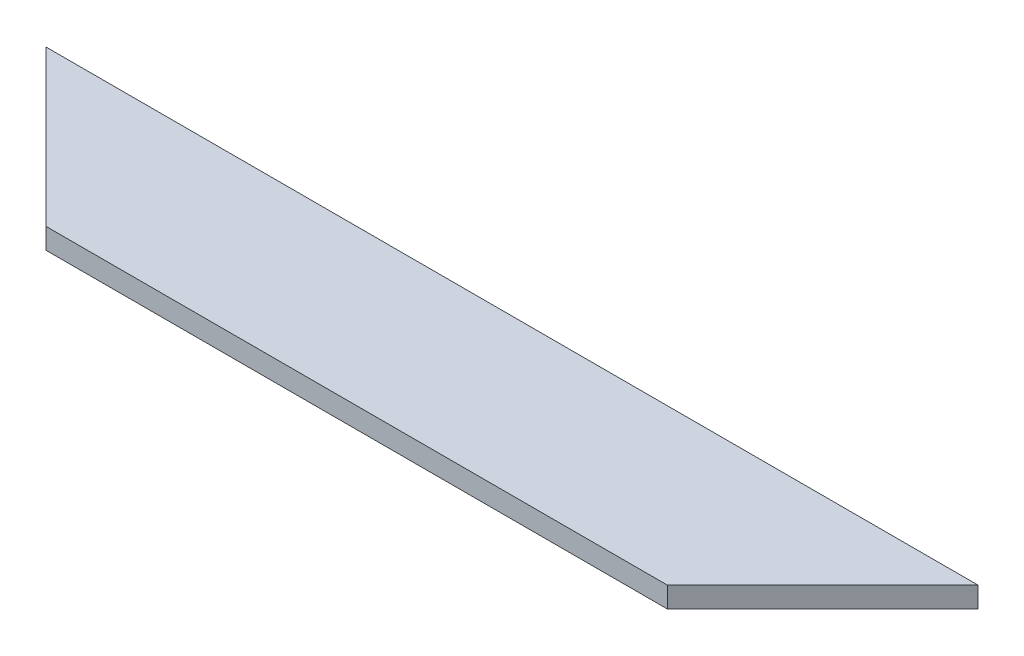
ISO-10303-21;
HEADER;
FILE_DESCRIPTION(('STEP AP214'),'2;1');
FILE_NAME('part.step','',(''),(''),'','','');
FILE_SCHEMA(('AUTOMOTIVE_DESIGN { 1 0 10303 214 1 1 1 1 }'));
ENDSEC;
DATA;
#1=APPLICATION_CONTEXT('core data for automotive mechanical design processes');
#2=APPLICATION_PROTOCOL_DEFINITION('international standard','automotive_design',2000,#1);
#3=PRODUCT_CONTEXT('',#1,'mechanical');
#4=PRODUCT('Part','Part','',(#3));
#5=PRODUCT_RELATED_PRODUCT_CATEGORY('part','',(#4));
#6=PRODUCT_DEFINITION_FORMATION('','',#4);
#7=PRODUCT_DEFINITION_CONTEXT('part definition',#1,'design');
#8=PRODUCT_DEFINITION('design','',#6,#7);
#9=PRODUCT_DEFINITION_SHAPE('','',#8);
#10=(LENGTH_UNIT() NAMED_UNIT(*) SI_UNIT(.MILLI.,.METRE.));
#11=(NAMED_UNIT(*) PLANE_ANGLE_UNIT() SI_UNIT($,.RADIAN.));
#12=(NAMED_UNIT(*) SI_UNIT($,.STERADIAN.) SOLID_ANGLE_UNIT());
#13=UNCERTAINTY_MEASURE_WITH_UNIT(LENGTH_MEASURE(1.E-05),#10,'distance_accuracy_value','');
#14=(GEOMETRIC_REPRESENTATION_CONTEXT(3) GLOBAL_UNCERTAINTY_ASSIGNED_CONTEXT((#13)) GLOBAL_UNIT_ASSIGNED_CONTEXT((#10,
#11,#12)) REPRESENTATION_CONTEXT('',''));
#15=CARTESIAN_POINT('',(0.,0.,0.));
#16=DIRECTION('',(0.,0.,1.));
#17=DIRECTION('',(1.,0.,0.));
#18=AXIS2_PLACEMENT_3D('',#15,#16,#17);
#19=CARTESIAN_POINT('',(90.,2.,-15.));
#20=DIRECTION('',(-0.707106781186551,0.,-0.707106781186544));
#21=DIRECTION('',(-0.707106781186544,0.,0.707106781186551));
#22=AXIS2_PLACEMENT_3D('',#19,#20,#21);
#23=PLANE('',#22);
#24=DIRECTION('',(0.707106781186544,0.,-0.707106781186551));
#25=VECTOR('',#24,1.);
#26=CARTESIAN_POINT('',(90.,0.,-15.));
#27=LINE('',#26,#25);
#28=CARTESIAN_POINT('',(75.0000000000002,0.,0.));
#29=VERTEX_POINT('',#28);
#30=CARTESIAN_POINT('',(90.,0.,-15.));
#31=VERTEX_POINT('',#30);
#32=EDGE_CURVE('E96',#29,#31,#27,.T.);
#33=ORIENTED_EDGE('',*,*,#32,.T.);
#34=DIRECTION('',(0.,-1.,0.));
#35=VECTOR('',#34,1.);
#36=CARTESIAN_POINT('',(90.,2.,-15.));
#37=LINE('',#36,#35);
#38=CARTESIAN_POINT('',(90.,2.,-15.));
#39=VERTEX_POINT('',#38);
#40=EDGE_CURVE('E11',#39,#31,#37,.T.);
#41=ORIENTED_EDGE('',*,*,#40,.F.);
#42=DIRECTION('',(0.707106781186544,0.,-0.707106781186551));
#43=VECTOR('',#42,1.);
#44=CARTESIAN_POINT('',(90.,2.,-15.));
#45=LINE('',#44,#43);
#46=CARTESIAN_POINT('',(75.0000000000002,2.,0.));
#47=VERTEX_POINT('',#46);
#48=EDGE_CURVE('E84',#47,#39,#45,.T.);
#49=ORIENTED_EDGE('',*,*,#48,.F.);
#50=DIRECTION('',(0.,-1.,0.));
#51=VECTOR('',#50,1.);
#52=CARTESIAN_POINT('',(75.0000000000002,2.,0.));
#53=LINE('',#52,#51);
#54=EDGE_CURVE('E92',#47,#29,#53,.T.);
#55=ORIENTED_EDGE('',*,*,#54,.T.);
#56=EDGE_LOOP('',(#33,#41,#49,#55));
#57=FACE_BOUND('',#56,.T.);
#58=ADVANCED_FACE('F33',(#57),#23,.F.);
#59=CARTESIAN_POINT('',(0.,2.,-15.));
#60=DIRECTION('',(0.,0.,1.));
#61=DIRECTION('',(1.,0.,0.));
#62=AXIS2_PLACEMENT_3D('',#59,#60,#61);
#63=PLANE('',#62);
#64=DIRECTION('',(-1.,0.,0.));
#65=VECTOR('',#64,1.);
#66=CARTESIAN_POINT('',(0.,0.,-15.));
#67=LINE('',#66,#65);
#68=CARTESIAN_POINT('',(0.,0.,-15.));
#69=VERTEX_POINT('',#68);
#70=EDGE_CURVE('E88',#31,#69,#67,.T.);
#71=ORIENTED_EDGE('',*,*,#70,.T.);
#72=DIRECTION('',(0.,-1.,0.));
#73=VECTOR('',#72,1.);
#74=CARTESIAN_POINT('',(0.,2.,-15.));
#75=LINE('',#74,#73);
#76=CARTESIAN_POINT('',(0.,2.,-15.));
#77=VERTEX_POINT('',#76);
#78=EDGE_CURVE('E41',#77,#69,#75,.T.);
#79=ORIENTED_EDGE('',*,*,#78,.F.);
#80=DIRECTION('',(-1.,0.,0.));
#81=VECTOR('',#80,1.);
#82=CARTESIAN_POINT('',(0.,2.,-15.));
#83=LINE('',#82,#81);
#84=EDGE_CURVE('E79',#39,#77,#83,.T.);
#85=ORIENTED_EDGE('',*,*,#84,.F.);
#86=ORIENTED_EDGE('',*,*,#40,.T.);
#87=EDGE_LOOP('',(#71,#79,#85,#86));
#88=FACE_BOUND('',#87,.T.);
#89=ADVANCED_FACE('F87',(#88),#63,.F.);
#90=CARTESIAN_POINT('',(0.,2.,-15.));
#91=DIRECTION('',(0.707106781186551,0.,-0.707106781186544));
#92=DIRECTION('',(-0.707106781186544,0.,-0.707106781186551));
#93=AXIS2_PLACEMENT_3D('',#90,#91,#92);
#94=PLANE('',#93);
#95=DIRECTION('',(0.707106781186544,0.,0.707106781186551));
#96=VECTOR('',#95,1.);
#97=CARTESIAN_POINT('',(0.,0.,-15.));
#98=LINE('',#97,#96);
#99=CARTESIAN_POINT('',(14.9999999999998,0.,0.));
#100=VERTEX_POINT('',#99);
#101=EDGE_CURVE('E66',#69,#100,#98,.T.);
#102=ORIENTED_EDGE('',*,*,#101,.T.);
#103=DIRECTION('',(0.,-1.,0.));
#104=VECTOR('',#103,1.);
#105=CARTESIAN_POINT('',(14.9999999999998,2.,0.));
#106=LINE('',#105,#104);
#107=CARTESIAN_POINT('',(14.9999999999998,2.,0.));
#108=VERTEX_POINT('',#107);
#109=EDGE_CURVE('E89',#108,#100,#106,.T.);
#110=ORIENTED_EDGE('',*,*,#109,.F.);
#111=DIRECTION('',(0.707106781186544,0.,0.707106781186551));
#112=VECTOR('',#111,1.);
#113=CARTESIAN_POINT('',(0.,2.,-15.));
#114=LINE('',#113,#112);
#115=EDGE_CURVE('E82',#77,#108,#114,.T.);
#116=ORIENTED_EDGE('',*,*,#115,.F.);
#117=ORIENTED_EDGE('',*,*,#78,.T.);
#118=EDGE_LOOP('',(#102,#110,#116,#117));
#119=FACE_BOUND('',#118,.T.);
#120=ADVANCED_FACE('F90',(#119),#94,.F.);
#121=CARTESIAN_POINT('',(14.9999999999998,2.,0.));
#122=DIRECTION('',(0.,0.,-1.));
#123=DIRECTION('',(-1.,0.,0.));
#124=AXIS2_PLACEMENT_3D('',#121,#122,#123);
#125=PLANE('',#124);
#126=DIRECTION('',(1.,0.,0.));
#127=VECTOR('',#126,1.);
#128=CARTESIAN_POINT('',(14.9999999999998,0.,0.));
#129=LINE('',#128,#127);
#130=EDGE_CURVE('E72',#100,#29,#129,.T.);
#131=ORIENTED_EDGE('',*,*,#130,.T.);
#132=ORIENTED_EDGE('',*,*,#54,.F.);
#133=DIRECTION('',(1.,0.,0.));
#134=VECTOR('',#133,1.);
#135=CARTESIAN_POINT('',(14.9999999999998,2.,0.));
#136=LINE('',#135,#134);
#137=EDGE_CURVE('E49',#108,#47,#136,.T.);
#138=ORIENTED_EDGE('',*,*,#137,.F.);
#139=ORIENTED_EDGE('',*,*,#109,.T.);
#140=EDGE_LOOP('',(#131,#132,#138,#139));
#141=FACE_BOUND('',#140,.T.);
#142=ADVANCED_FACE('F103',(#141),#125,.F.);
#143=CARTESIAN_POINT('',(0.,2.,0.));
#144=DIRECTION('',(0.,1.,0.));
#145=DIRECTION('',(0.,0.,1.));
#146=AXIS2_PLACEMENT_3D('',#143,#144,#145);
#147=PLANE('',#146);
#148=ORIENTED_EDGE('',*,*,#48,.T.);
#149=ORIENTED_EDGE('',*,*,#84,.T.);
#150=ORIENTED_EDGE('',*,*,#115,.T.);
#151=ORIENTED_EDGE('',*,*,#137,.T.);
#152=EDGE_LOOP('',(#148,#149,#150,#151));
#153=FACE_BOUND('',#152,.T.);
#154=ADVANCED_FACE('F80',(#153),#147,.T.);
#155=CARTESIAN_POINT('',(0.,0.,0.));
#156=DIRECTION('',(0.,1.,0.));
#157=DIRECTION('',(0.,0.,1.));
#158=AXIS2_PLACEMENT_3D('',#155,#156,#157);
#159=PLANE('',#158);
#160=ORIENTED_EDGE('',*,*,#32,.F.);
#161=ORIENTED_EDGE('',*,*,#130,.F.);
#162=ORIENTED_EDGE('',*,*,#101,.F.);
#163=ORIENTED_EDGE('',*,*,#70,.F.);
#164=EDGE_LOOP('',(#160,#161,#162,#163));
#165=FACE_BOUND('',#164,.T.);
#166=ADVANCED_FACE('F106',(#165),#159,.F.);
#167=CLOSED_SHELL('',(#58,#89,#120,#142,#154,#166));
#168=MANIFOLD_SOLID_BREP('B2',#167);
#169=ADVANCED_BREP_SHAPE_REPRESENTATION('',(#18,#168),#14);
#170=SHAPE_DEFINITION_REPRESENTATION(#9,#169);
ENDSEC;
END-ISO-10303-21;
